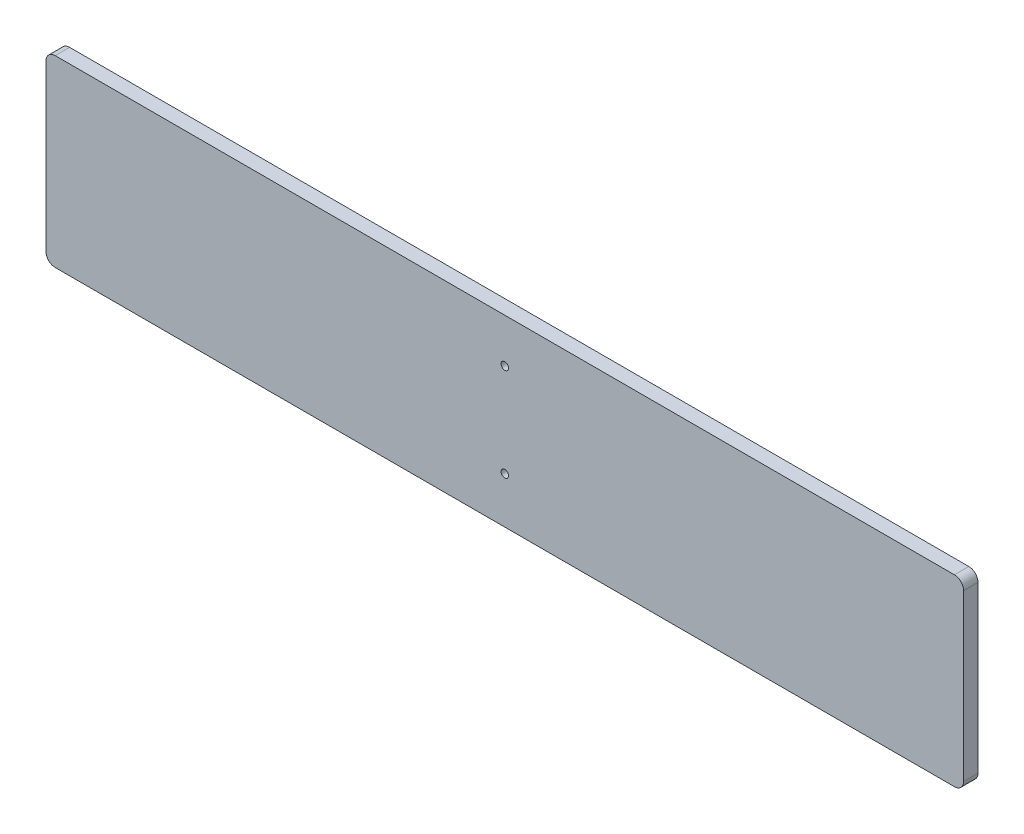
ISO-10303-21;
HEADER;
FILE_DESCRIPTION(('STEP AP214'),'2;1');
FILE_NAME('part.step','',(''),(''),'','','');
FILE_SCHEMA(('AUTOMOTIVE_DESIGN { 1 0 10303 214 1 1 1 1 }'));
ENDSEC;
DATA;
#1=APPLICATION_CONTEXT('core data for automotive mechanical design processes');
#2=APPLICATION_PROTOCOL_DEFINITION('international standard','automotive_design',2000,#1);
#3=PRODUCT_CONTEXT('',#1,'mechanical');
#4=PRODUCT('Part','Part','',(#3));
#5=PRODUCT_RELATED_PRODUCT_CATEGORY('part','',(#4));
#6=PRODUCT_DEFINITION_FORMATION('','',#4);
#7=PRODUCT_DEFINITION_CONTEXT('part definition',#1,'design');
#8=PRODUCT_DEFINITION('design','',#6,#7);
#9=PRODUCT_DEFINITION_SHAPE('','',#8);
#10=(LENGTH_UNIT() NAMED_UNIT(*) SI_UNIT(.MILLI.,.METRE.));
#11=(NAMED_UNIT(*) PLANE_ANGLE_UNIT() SI_UNIT($,.RADIAN.));
#12=(NAMED_UNIT(*) SI_UNIT($,.STERADIAN.) SOLID_ANGLE_UNIT());
#13=UNCERTAINTY_MEASURE_WITH_UNIT(LENGTH_MEASURE(1.E-05),#10,'distance_accuracy_value','');
#14=(GEOMETRIC_REPRESENTATION_CONTEXT(3) GLOBAL_UNCERTAINTY_ASSIGNED_CONTEXT((#13)) GLOBAL_UNIT_ASSIGNED_CONTEXT((#10,
#11,#12)) REPRESENTATION_CONTEXT('',''));
#15=CARTESIAN_POINT('',(0.,0.,0.));
#16=DIRECTION('',(0.,0.,1.));
#17=DIRECTION('',(1.,0.,0.));
#18=AXIS2_PLACEMENT_3D('',#15,#16,#17);
#19=CARTESIAN_POINT('',(0.,-4.953,0.));
#20=DIRECTION('',(0.,0.,1.));
#21=DIRECTION('',(1.,0.,0.));
#22=AXIS2_PLACEMENT_3D('',#19,#20,#21);
#23=CYLINDRICAL_SURFACE('',#22,0.4065);
#24=CARTESIAN_POINT('',(0.,-4.953,0.));
#25=DIRECTION('',(0.,0.,1.));
#26=DIRECTION('',(1.,0.,0.));
#27=AXIS2_PLACEMENT_3D('',#24,#25,#26);
#28=CIRCLE('',#27,0.4065);
#29=CARTESIAN_POINT('',(-0.4065,-4.953,0.));
#30=VERTEX_POINT('',#29);
#31=EDGE_CURVE('E42',#30,#30,#28,.T.);
#32=ORIENTED_EDGE('',*,*,#31,.F.);
#33=DIRECTION('',(0.,0.,1.));
#34=VECTOR('',#33,1.);
#35=CARTESIAN_POINT('',(-0.4065,-4.953,0.));
#36=LINE('',#35,#34);
#37=CARTESIAN_POINT('',(-0.4065,-4.953,1.57));
#38=VERTEX_POINT('',#37);
#39=EDGE_CURVE('E11',#30,#38,#36,.T.);
#40=ORIENTED_EDGE('',*,*,#39,.T.);
#41=CARTESIAN_POINT('',(0.,-4.953,1.57));
#42=DIRECTION('',(0.,0.,-1.));
#43=DIRECTION('',(1.,0.,0.));
#44=AXIS2_PLACEMENT_3D('',#41,#42,#43);
#45=CIRCLE('',#44,0.4065);
#46=EDGE_CURVE('E116',#38,#38,#45,.T.);
#47=ORIENTED_EDGE('',*,*,#46,.F.);
#48=ORIENTED_EDGE('',*,*,#39,.F.);
#49=EDGE_LOOP('',(#32,#40,#47,#48));
#50=FACE_BOUND('',#49,.T.);
#51=ADVANCED_FACE('F18',(#50),#23,.F.);
#52=CARTESIAN_POINT('',(0.,5.207,0.));
#53=DIRECTION('',(0.,0.,1.));
#54=DIRECTION('',(1.,0.,0.));
#55=AXIS2_PLACEMENT_3D('',#52,#53,#54);
#56=CYLINDRICAL_SURFACE('',#55,0.4065);
#57=CARTESIAN_POINT('',(0.,5.207,0.));
#58=DIRECTION('',(0.,0.,1.));
#59=DIRECTION('',(1.,0.,0.));
#60=AXIS2_PLACEMENT_3D('',#57,#58,#59);
#61=CIRCLE('',#60,0.4065);
#62=CARTESIAN_POINT('',(-0.4065,5.207,0.));
#63=VERTEX_POINT('',#62);
#64=EDGE_CURVE('E192',#63,#63,#61,.T.);
#65=ORIENTED_EDGE('',*,*,#64,.F.);
#66=DIRECTION('',(0.,0.,1.));
#67=VECTOR('',#66,1.);
#68=CARTESIAN_POINT('',(-0.4065,5.207,0.));
#69=LINE('',#68,#67);
#70=CARTESIAN_POINT('',(-0.4065,5.207,1.57));
#71=VERTEX_POINT('',#70);
#72=EDGE_CURVE('E29',#63,#71,#69,.T.);
#73=ORIENTED_EDGE('',*,*,#72,.T.);
#74=CARTESIAN_POINT('',(0.,5.207,1.57));
#75=DIRECTION('',(0.,0.,-1.));
#76=DIRECTION('',(1.,0.,0.));
#77=AXIS2_PLACEMENT_3D('',#74,#75,#76);
#78=CIRCLE('',#77,0.4065);
#79=EDGE_CURVE('E198',#71,#71,#78,.T.);
#80=ORIENTED_EDGE('',*,*,#79,.F.);
#81=ORIENTED_EDGE('',*,*,#72,.F.);
#82=EDGE_LOOP('',(#65,#73,#80,#81));
#83=FACE_BOUND('',#82,.T.);
#84=ADVANCED_FACE('F240',(#83),#56,.F.);
#85=CARTESIAN_POINT('',(49.,-9.,0.));
#86=DIRECTION('',(0.,0.,1.));
#87=DIRECTION('',(0.,-1.,0.));
#88=AXIS2_PLACEMENT_3D('',#85,#86,#87);
#89=CYLINDRICAL_SURFACE('',#88,1.);
#90=CARTESIAN_POINT('',(49.,-9.,0.));
#91=DIRECTION('',(0.,0.,1.));
#92=DIRECTION('',(0.,-1.,0.));
#93=AXIS2_PLACEMENT_3D('',#90,#91,#92);
#94=CIRCLE('',#93,1.);
#95=CARTESIAN_POINT('',(49.,-10.,0.));
#96=VERTEX_POINT('',#95);
#97=CARTESIAN_POINT('',(50.,-9.,0.));
#98=VERTEX_POINT('',#97);
#99=EDGE_CURVE('E164',#96,#98,#94,.T.);
#100=ORIENTED_EDGE('',*,*,#99,.T.);
#101=DIRECTION('',(0.,0.,1.));
#102=VECTOR('',#101,1.);
#103=CARTESIAN_POINT('',(50.,-9.,0.));
#104=LINE('',#103,#102);
#105=CARTESIAN_POINT('',(50.,-9.,1.57));
#106=VERTEX_POINT('',#105);
#107=EDGE_CURVE('E109',#98,#106,#104,.T.);
#108=ORIENTED_EDGE('',*,*,#107,.T.);
#109=CARTESIAN_POINT('',(49.,-9.,1.57));
#110=DIRECTION('',(0.,0.,1.));
#111=DIRECTION('',(0.,-1.,0.));
#112=AXIS2_PLACEMENT_3D('',#109,#110,#111);
#113=CIRCLE('',#112,1.);
#114=CARTESIAN_POINT('',(49.,-10.,1.57));
#115=VERTEX_POINT('',#114);
#116=EDGE_CURVE('E106',#115,#106,#113,.T.);
#117=ORIENTED_EDGE('',*,*,#116,.F.);
#118=DIRECTION('',(0.,0.,1.));
#119=VECTOR('',#118,1.);
#120=CARTESIAN_POINT('',(49.,-10.,0.));
#121=LINE('',#120,#119);
#122=EDGE_CURVE('E101',#96,#115,#121,.T.);
#123=ORIENTED_EDGE('',*,*,#122,.F.);
#124=EDGE_LOOP('',(#100,#108,#117,#123));
#125=FACE_BOUND('',#124,.T.);
#126=ADVANCED_FACE('F107',(#125),#89,.T.);
#127=CARTESIAN_POINT('',(-49.,-10.,0.));
#128=DIRECTION('',(0.,-1.,0.));
#129=DIRECTION('',(0.,0.,-1.));
#130=AXIS2_PLACEMENT_3D('',#127,#128,#129);
#131=PLANE('',#130);
#132=DIRECTION('',(1.,0.,0.));
#133=VECTOR('',#132,1.);
#134=CARTESIAN_POINT('',(-49.,-10.,0.));
#135=LINE('',#134,#133);
#136=CARTESIAN_POINT('',(-49.,-10.,0.));
#137=VERTEX_POINT('',#136);
#138=EDGE_CURVE('E124',#137,#96,#135,.T.);
#139=ORIENTED_EDGE('',*,*,#138,.T.);
#140=ORIENTED_EDGE('',*,*,#122,.T.);
#141=DIRECTION('',(1.,0.,0.));
#142=VECTOR('',#141,1.);
#143=CARTESIAN_POINT('',(-49.,-10.,1.57));
#144=LINE('',#143,#142);
#145=CARTESIAN_POINT('',(-49.,-10.,1.57));
#146=VERTEX_POINT('',#145);
#147=EDGE_CURVE('E115',#146,#115,#144,.T.);
#148=ORIENTED_EDGE('',*,*,#147,.F.);
#149=DIRECTION('',(0.,0.,1.));
#150=VECTOR('',#149,1.);
#151=CARTESIAN_POINT('',(-49.,-10.,0.));
#152=LINE('',#151,#150);
#153=EDGE_CURVE('E146',#137,#146,#152,.T.);
#154=ORIENTED_EDGE('',*,*,#153,.F.);
#155=EDGE_LOOP('',(#139,#140,#148,#154));
#156=FACE_BOUND('',#155,.T.);
#157=ADVANCED_FACE('F120',(#156),#131,.T.);
#158=CARTESIAN_POINT('',(-49.,-9.,0.));
#159=DIRECTION('',(0.,0.,1.));
#160=DIRECTION('',(-1.,0.,0.));
#161=AXIS2_PLACEMENT_3D('',#158,#159,#160);
#162=CYLINDRICAL_SURFACE('',#161,1.);
#163=CARTESIAN_POINT('',(-49.,-9.,0.));
#164=DIRECTION('',(0.,0.,1.));
#165=DIRECTION('',(-1.,0.,0.));
#166=AXIS2_PLACEMENT_3D('',#163,#164,#165);
#167=CIRCLE('',#166,1.);
#168=CARTESIAN_POINT('',(-50.,-9.,0.));
#169=VERTEX_POINT('',#168);
#170=EDGE_CURVE('E126',#169,#137,#167,.T.);
#171=ORIENTED_EDGE('',*,*,#170,.T.);
#172=ORIENTED_EDGE('',*,*,#153,.T.);
#173=CARTESIAN_POINT('',(-49.,-9.,1.57));
#174=DIRECTION('',(0.,0.,1.));
#175=DIRECTION('',(-1.,0.,0.));
#176=AXIS2_PLACEMENT_3D('',#173,#174,#175);
#177=CIRCLE('',#176,1.);
#178=CARTESIAN_POINT('',(-50.,-9.,1.57));
#179=VERTEX_POINT('',#178);
#180=EDGE_CURVE('E133',#179,#146,#177,.T.);
#181=ORIENTED_EDGE('',*,*,#180,.F.);
#182=DIRECTION('',(0.,0.,1.));
#183=VECTOR('',#182,1.);
#184=CARTESIAN_POINT('',(-50.,-9.,0.));
#185=LINE('',#184,#183);
#186=EDGE_CURVE('E171',#169,#179,#185,.T.);
#187=ORIENTED_EDGE('',*,*,#186,.F.);
#188=EDGE_LOOP('',(#171,#172,#181,#187));
#189=FACE_BOUND('',#188,.T.);
#190=ADVANCED_FACE('F261',(#189),#162,.T.);
#191=CARTESIAN_POINT('',(-50.,9.,0.));
#192=DIRECTION('',(-1.,0.,0.));
#193=DIRECTION('',(0.,0.,1.));
#194=AXIS2_PLACEMENT_3D('',#191,#192,#193);
#195=PLANE('',#194);
#196=DIRECTION('',(0.,-1.,0.));
#197=VECTOR('',#196,1.);
#198=CARTESIAN_POINT('',(-50.,9.,0.));
#199=LINE('',#198,#197);
#200=CARTESIAN_POINT('',(-50.,9.,0.));
#201=VERTEX_POINT('',#200);
#202=EDGE_CURVE('E148',#201,#169,#199,.T.);
#203=ORIENTED_EDGE('',*,*,#202,.T.);
#204=ORIENTED_EDGE('',*,*,#186,.T.);
#205=DIRECTION('',(0.,-1.,0.));
#206=VECTOR('',#205,1.);
#207=CARTESIAN_POINT('',(-50.,9.,1.57));
#208=LINE('',#207,#206);
#209=CARTESIAN_POINT('',(-50.,9.,1.57));
#210=VERTEX_POINT('',#209);
#211=EDGE_CURVE('E140',#210,#179,#208,.T.);
#212=ORIENTED_EDGE('',*,*,#211,.F.);
#213=DIRECTION('',(0.,0.,1.));
#214=VECTOR('',#213,1.);
#215=CARTESIAN_POINT('',(-50.,9.,0.));
#216=LINE('',#215,#214);
#217=EDGE_CURVE('E169',#201,#210,#216,.T.);
#218=ORIENTED_EDGE('',*,*,#217,.F.);
#219=EDGE_LOOP('',(#203,#204,#212,#218));
#220=FACE_BOUND('',#219,.T.);
#221=ADVANCED_FACE('F20',(#220),#195,.T.);
#222=CARTESIAN_POINT('',(-49.,9.,0.));
#223=DIRECTION('',(0.,0.,1.));
#224=DIRECTION('',(0.,1.,0.));
#225=AXIS2_PLACEMENT_3D('',#222,#223,#224);
#226=CYLINDRICAL_SURFACE('',#225,1.);
#227=CARTESIAN_POINT('',(-49.,9.,0.));
#228=DIRECTION('',(0.,0.,1.));
#229=DIRECTION('',(0.,1.,0.));
#230=AXIS2_PLACEMENT_3D('',#227,#228,#229);
#231=CIRCLE('',#230,1.);
#232=CARTESIAN_POINT('',(-49.,10.,0.));
#233=VERTEX_POINT('',#232);
#234=EDGE_CURVE('E144',#233,#201,#231,.T.);
#235=ORIENTED_EDGE('',*,*,#234,.T.);
#236=ORIENTED_EDGE('',*,*,#217,.T.);
#237=CARTESIAN_POINT('',(-49.,9.,1.57));
#238=DIRECTION('',(0.,0.,1.));
#239=DIRECTION('',(0.,1.,0.));
#240=AXIS2_PLACEMENT_3D('',#237,#238,#239);
#241=CIRCLE('',#240,1.);
#242=CARTESIAN_POINT('',(-49.,10.,1.57));
#243=VERTEX_POINT('',#242);
#244=EDGE_CURVE('E149',#243,#210,#241,.T.);
#245=ORIENTED_EDGE('',*,*,#244,.F.);
#246=DIRECTION('',(0.,0.,1.));
#247=VECTOR('',#246,1.);
#248=CARTESIAN_POINT('',(-49.,10.,0.));
#249=LINE('',#248,#247);
#250=EDGE_CURVE('E74',#233,#243,#249,.T.);
#251=ORIENTED_EDGE('',*,*,#250,.F.);
#252=EDGE_LOOP('',(#235,#236,#245,#251));
#253=FACE_BOUND('',#252,.T.);
#254=ADVANCED_FACE('F265',(#253),#226,.T.);
#255=CARTESIAN_POINT('',(49.,10.,0.));
#256=DIRECTION('',(0.,1.,0.));
#257=DIRECTION('',(1.,0.,0.));
#258=AXIS2_PLACEMENT_3D('',#255,#256,#257);
#259=PLANE('',#258);
#260=DIRECTION('',(-1.,0.,0.));
#261=VECTOR('',#260,1.);
#262=CARTESIAN_POINT('',(49.,10.,0.));
#263=LINE('',#262,#261);
#264=CARTESIAN_POINT('',(49.,10.,0.));
#265=VERTEX_POINT('',#264);
#266=EDGE_CURVE('E166',#265,#233,#263,.T.);
#267=ORIENTED_EDGE('',*,*,#266,.T.);
#268=ORIENTED_EDGE('',*,*,#250,.T.);
#269=DIRECTION('',(-1.,0.,0.));
#270=VECTOR('',#269,1.);
#271=CARTESIAN_POINT('',(49.,10.,1.57));
#272=LINE('',#271,#270);
#273=CARTESIAN_POINT('',(49.,10.,1.57));
#274=VERTEX_POINT('',#273);
#275=EDGE_CURVE('E22',#274,#243,#272,.T.);
#276=ORIENTED_EDGE('',*,*,#275,.F.);
#277=DIRECTION('',(0.,0.,1.));
#278=VECTOR('',#277,1.);
#279=CARTESIAN_POINT('',(49.,10.,0.));
#280=LINE('',#279,#278);
#281=EDGE_CURVE('E186',#265,#274,#280,.T.);
#282=ORIENTED_EDGE('',*,*,#281,.F.);
#283=EDGE_LOOP('',(#267,#268,#276,#282));
#284=FACE_BOUND('',#283,.T.);
#285=ADVANCED_FACE('F267',(#284),#259,.T.);
#286=CARTESIAN_POINT('',(49.,9.,0.));
#287=DIRECTION('',(0.,0.,1.));
#288=DIRECTION('',(1.,0.,0.));
#289=AXIS2_PLACEMENT_3D('',#286,#287,#288);
#290=CYLINDRICAL_SURFACE('',#289,1.);
#291=CARTESIAN_POINT('',(49.,9.,0.));
#292=DIRECTION('',(0.,0.,1.));
#293=DIRECTION('',(1.,0.,0.));
#294=AXIS2_PLACEMENT_3D('',#291,#292,#293);
#295=CIRCLE('',#294,1.);
#296=CARTESIAN_POINT('',(50.,9.,0.));
#297=VERTEX_POINT('',#296);
#298=EDGE_CURVE('E188',#297,#265,#295,.T.);
#299=ORIENTED_EDGE('',*,*,#298,.T.);
#300=ORIENTED_EDGE('',*,*,#281,.T.);
#301=CARTESIAN_POINT('',(49.,9.,1.57));
#302=DIRECTION('',(0.,0.,1.));
#303=DIRECTION('',(1.,0.,0.));
#304=AXIS2_PLACEMENT_3D('',#301,#302,#303);
#305=CIRCLE('',#304,1.);
#306=CARTESIAN_POINT('',(50.,9.,1.57));
#307=VERTEX_POINT('',#306);
#308=EDGE_CURVE('E156',#307,#274,#305,.T.);
#309=ORIENTED_EDGE('',*,*,#308,.F.);
#310=DIRECTION('',(0.,0.,1.));
#311=VECTOR('',#310,1.);
#312=CARTESIAN_POINT('',(50.,9.,0.));
#313=LINE('',#312,#311);
#314=EDGE_CURVE('E178',#297,#307,#313,.T.);
#315=ORIENTED_EDGE('',*,*,#314,.F.);
#316=EDGE_LOOP('',(#299,#300,#309,#315));
#317=FACE_BOUND('',#316,.T.);
#318=ADVANCED_FACE('F308',(#317),#290,.T.);
#319=CARTESIAN_POINT('',(50.,-9.,0.));
#320=DIRECTION('',(1.,0.,0.));
#321=DIRECTION('',(0.,1.,0.));
#322=AXIS2_PLACEMENT_3D('',#319,#320,#321);
#323=PLANE('',#322);
#324=DIRECTION('',(0.,1.,0.));
#325=VECTOR('',#324,1.);
#326=CARTESIAN_POINT('',(50.,-9.,0.));
#327=LINE('',#326,#325);
#328=EDGE_CURVE('E182',#98,#297,#327,.T.);
#329=ORIENTED_EDGE('',*,*,#328,.T.);
#330=ORIENTED_EDGE('',*,*,#314,.T.);
#331=DIRECTION('',(0.,1.,0.));
#332=VECTOR('',#331,1.);
#333=CARTESIAN_POINT('',(50.,-9.,1.57));
#334=LINE('',#333,#332);
#335=EDGE_CURVE('E183',#106,#307,#334,.T.);
#336=ORIENTED_EDGE('',*,*,#335,.F.);
#337=ORIENTED_EDGE('',*,*,#107,.F.);
#338=EDGE_LOOP('',(#329,#330,#336,#337));
#339=FACE_BOUND('',#338,.T.);
#340=ADVANCED_FACE('F250',(#339),#323,.T.);
#341=CARTESIAN_POINT('',(0.,0.,1.57));
#342=DIRECTION('',(0.,0.,1.));
#343=DIRECTION('',(1.,0.,0.));
#344=AXIS2_PLACEMENT_3D('',#341,#342,#343);
#345=PLANE('',#344);
#346=ORIENTED_EDGE('',*,*,#335,.T.);
#347=ORIENTED_EDGE('',*,*,#308,.T.);
#348=ORIENTED_EDGE('',*,*,#275,.T.);
#349=ORIENTED_EDGE('',*,*,#244,.T.);
#350=ORIENTED_EDGE('',*,*,#211,.T.);
#351=ORIENTED_EDGE('',*,*,#180,.T.);
#352=ORIENTED_EDGE('',*,*,#147,.T.);
#353=ORIENTED_EDGE('',*,*,#116,.T.);
#354=EDGE_LOOP('',(#346,#347,#348,#349,#350,#351,#352,#353));
#355=FACE_BOUND('',#354,.T.);
#356=ORIENTED_EDGE('',*,*,#46,.T.);
#357=EDGE_LOOP('',(#356));
#358=FACE_BOUND('',#357,.T.);
#359=ORIENTED_EDGE('',*,*,#79,.T.);
#360=EDGE_LOOP('',(#359));
#361=FACE_BOUND('',#360,.T.);
#362=ADVANCED_FACE('F129',(#355,#358,#361),#345,.T.);
#363=CARTESIAN_POINT('',(0.,0.,0.));
#364=DIRECTION('',(0.,0.,1.));
#365=DIRECTION('',(1.,0.,0.));
#366=AXIS2_PLACEMENT_3D('',#363,#364,#365);
#367=PLANE('',#366);
#368=ORIENTED_EDGE('',*,*,#328,.F.);
#369=ORIENTED_EDGE('',*,*,#99,.F.);
#370=ORIENTED_EDGE('',*,*,#138,.F.);
#371=ORIENTED_EDGE('',*,*,#170,.F.);
#372=ORIENTED_EDGE('',*,*,#202,.F.);
#373=ORIENTED_EDGE('',*,*,#234,.F.);
#374=ORIENTED_EDGE('',*,*,#266,.F.);
#375=ORIENTED_EDGE('',*,*,#298,.F.);
#376=EDGE_LOOP('',(#368,#369,#370,#371,#372,#373,#374,#375));
#377=FACE_BOUND('',#376,.T.);
#378=ORIENTED_EDGE('',*,*,#31,.T.);
#379=EDGE_LOOP('',(#378));
#380=FACE_BOUND('',#379,.T.);
#381=ORIENTED_EDGE('',*,*,#64,.T.);
#382=EDGE_LOOP('',(#381));
#383=FACE_BOUND('',#382,.T.);
#384=ADVANCED_FACE('F242',(#377,#380,#383),#367,.F.);
#385=CLOSED_SHELL('',(#51,#84,#126,#157,#190,#221,#254,#285,#318,#340,#362,#384));
#386=MANIFOLD_SOLID_BREP('B1',#385);
#387=ADVANCED_BREP_SHAPE_REPRESENTATION('',(#18,#386),#14);
#388=SHAPE_DEFINITION_REPRESENTATION(#9,#387);
ENDSEC;
END-ISO-10303-21;
